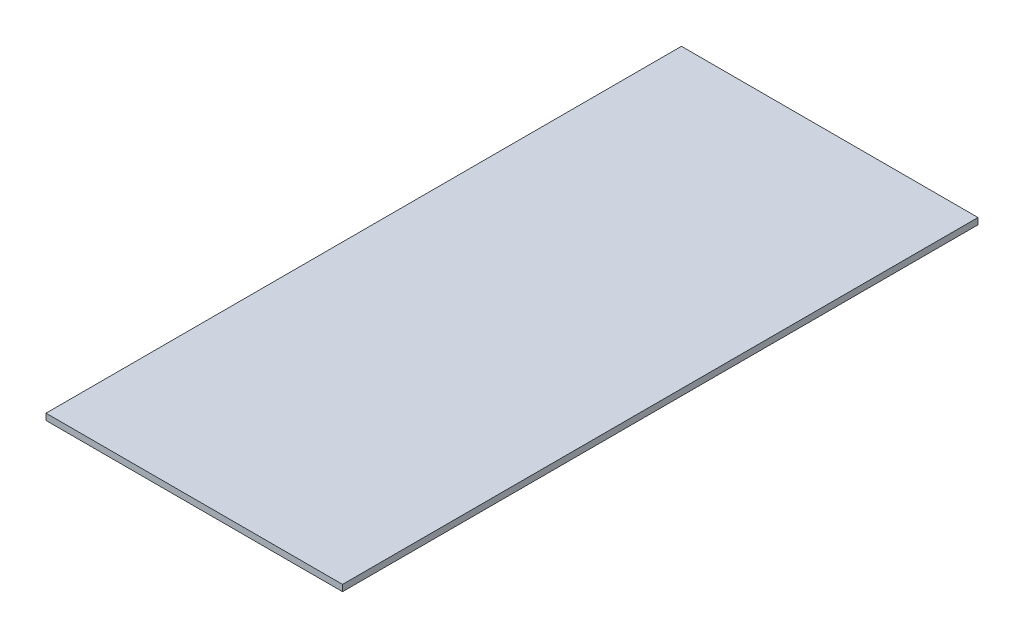
ISO-10303-21;
HEADER;
FILE_DESCRIPTION(('STEP AP214'),'2;1');
FILE_NAME('part.step','',(''),(''),'','','');
FILE_SCHEMA(('AUTOMOTIVE_DESIGN { 1 0 10303 214 1 1 1 1 }'));
ENDSEC;
DATA;
#1=APPLICATION_CONTEXT('core data for automotive mechanical design processes');
#2=APPLICATION_PROTOCOL_DEFINITION('international standard','automotive_design',2000,#1);
#3=PRODUCT_CONTEXT('',#1,'mechanical');
#4=PRODUCT('Part','Part','',(#3));
#5=PRODUCT_RELATED_PRODUCT_CATEGORY('part','',(#4));
#6=PRODUCT_DEFINITION_FORMATION('','',#4);
#7=PRODUCT_DEFINITION_CONTEXT('part definition',#1,'design');
#8=PRODUCT_DEFINITION('design','',#6,#7);
#9=PRODUCT_DEFINITION_SHAPE('','',#8);
#10=(LENGTH_UNIT() NAMED_UNIT(*) SI_UNIT(.MILLI.,.METRE.));
#11=(NAMED_UNIT(*) PLANE_ANGLE_UNIT() SI_UNIT($,.RADIAN.));
#12=(NAMED_UNIT(*) SI_UNIT($,.STERADIAN.) SOLID_ANGLE_UNIT());
#13=UNCERTAINTY_MEASURE_WITH_UNIT(LENGTH_MEASURE(1.E-05),#10,'distance_accuracy_value','');
#14=(GEOMETRIC_REPRESENTATION_CONTEXT(3) GLOBAL_UNCERTAINTY_ASSIGNED_CONTEXT((#13)) GLOBAL_UNIT_ASSIGNED_CONTEXT((#10,
#11,#12)) REPRESENTATION_CONTEXT('',''));
#15=CARTESIAN_POINT('',(0.,0.,0.));
#16=DIRECTION('',(0.,0.,1.));
#17=DIRECTION('',(1.,0.,0.));
#18=AXIS2_PLACEMENT_3D('',#15,#16,#17);
#19=CARTESIAN_POINT('',(0.,0.,0.));
#20=DIRECTION('',(0.,1.,0.));
#21=DIRECTION('',(1.,0.,0.));
#22=AXIS2_PLACEMENT_3D('',#19,#20,#21);
#23=PLANE('',#22);
#24=DIRECTION('',(0.,0.,-1.));
#25=VECTOR('',#24,1.);
#26=CARTESIAN_POINT('',(70.,0.,150.));
#27=LINE('',#26,#25);
#28=CARTESIAN_POINT('',(70.,0.,150.));
#29=VERTEX_POINT('',#28);
#30=CARTESIAN_POINT('',(70.,0.,-150.));
#31=VERTEX_POINT('',#30);
#32=EDGE_CURVE('E20',#29,#31,#27,.T.);
#33=ORIENTED_EDGE('',*,*,#32,.F.);
#34=DIRECTION('',(1.,0.,0.));
#35=VECTOR('',#34,1.);
#36=CARTESIAN_POINT('',(-70.,0.,150.));
#37=LINE('',#36,#35);
#38=CARTESIAN_POINT('',(-70.,0.,150.));
#39=VERTEX_POINT('',#38);
#40=EDGE_CURVE('E126',#39,#29,#37,.T.);
#41=ORIENTED_EDGE('',*,*,#40,.F.);
#42=DIRECTION('',(0.,0.,1.));
#43=VECTOR('',#42,1.);
#44=CARTESIAN_POINT('',(-70.,0.,-150.));
#45=LINE('',#44,#43);
#46=CARTESIAN_POINT('',(-70.,0.,-150.));
#47=VERTEX_POINT('',#46);
#48=EDGE_CURVE('E83',#47,#39,#45,.T.);
#49=ORIENTED_EDGE('',*,*,#48,.F.);
#50=DIRECTION('',(-1.,0.,0.));
#51=VECTOR('',#50,1.);
#52=CARTESIAN_POINT('',(70.,0.,-150.));
#53=LINE('',#52,#51);
#54=EDGE_CURVE('E68',#31,#47,#53,.T.);
#55=ORIENTED_EDGE('',*,*,#54,.F.);
#56=EDGE_LOOP('',(#33,#41,#49,#55));
#57=FACE_BOUND('',#56,.T.);
#58=ADVANCED_FACE('F17',(#57),#23,.F.);
#59=CARTESIAN_POINT('',(0.,3.,0.));
#60=DIRECTION('',(0.,1.,0.));
#61=DIRECTION('',(1.,0.,0.));
#62=AXIS2_PLACEMENT_3D('',#59,#60,#61);
#63=PLANE('',#62);
#64=DIRECTION('',(0.,0.,-1.));
#65=VECTOR('',#64,1.);
#66=CARTESIAN_POINT('',(70.,3.,150.));
#67=LINE('',#66,#65);
#68=CARTESIAN_POINT('',(70.,3.,150.));
#69=VERTEX_POINT('',#68);
#70=CARTESIAN_POINT('',(70.,3.,-150.));
#71=VERTEX_POINT('',#70);
#72=EDGE_CURVE('E11',#69,#71,#67,.T.);
#73=ORIENTED_EDGE('',*,*,#72,.T.);
#74=DIRECTION('',(-1.,0.,0.));
#75=VECTOR('',#74,1.);
#76=CARTESIAN_POINT('',(70.,3.,-150.));
#77=LINE('',#76,#75);
#78=CARTESIAN_POINT('',(-70.,3.,-150.));
#79=VERTEX_POINT('',#78);
#80=EDGE_CURVE('E59',#71,#79,#77,.T.);
#81=ORIENTED_EDGE('',*,*,#80,.T.);
#82=DIRECTION('',(0.,0.,1.));
#83=VECTOR('',#82,1.);
#84=CARTESIAN_POINT('',(-70.,3.,-150.));
#85=LINE('',#84,#83);
#86=CARTESIAN_POINT('',(-70.,3.,150.));
#87=VERTEX_POINT('',#86);
#88=EDGE_CURVE('E62',#79,#87,#85,.T.);
#89=ORIENTED_EDGE('',*,*,#88,.T.);
#90=DIRECTION('',(1.,0.,0.));
#91=VECTOR('',#90,1.);
#92=CARTESIAN_POINT('',(-70.,3.,150.));
#93=LINE('',#92,#91);
#94=EDGE_CURVE('E116',#87,#69,#93,.T.);
#95=ORIENTED_EDGE('',*,*,#94,.T.);
#96=EDGE_LOOP('',(#73,#81,#89,#95));
#97=FACE_BOUND('',#96,.T.);
#98=ADVANCED_FACE('F58',(#97),#63,.T.);
#99=CARTESIAN_POINT('',(70.,0.,150.));
#100=DIRECTION('',(1.,0.,0.));
#101=DIRECTION('',(0.,0.,-1.));
#102=AXIS2_PLACEMENT_3D('',#99,#100,#101);
#103=PLANE('',#102);
#104=ORIENTED_EDGE('',*,*,#32,.T.);
#105=DIRECTION('',(0.,1.,0.));
#106=VECTOR('',#105,1.);
#107=CARTESIAN_POINT('',(70.,0.,-150.));
#108=LINE('',#107,#106);
#109=EDGE_CURVE('E70',#31,#71,#108,.T.);
#110=ORIENTED_EDGE('',*,*,#109,.T.);
#111=ORIENTED_EDGE('',*,*,#72,.F.);
#112=DIRECTION('',(0.,1.,0.));
#113=VECTOR('',#112,1.);
#114=CARTESIAN_POINT('',(70.,0.,150.));
#115=LINE('',#114,#113);
#116=EDGE_CURVE('E120',#29,#69,#115,.T.);
#117=ORIENTED_EDGE('',*,*,#116,.F.);
#118=EDGE_LOOP('',(#104,#110,#111,#117));
#119=FACE_BOUND('',#118,.T.);
#120=ADVANCED_FACE('F163',(#119),#103,.T.);
#121=CARTESIAN_POINT('',(70.,0.,-150.));
#122=DIRECTION('',(0.,0.,-1.));
#123=DIRECTION('',(0.,-1.,0.));
#124=AXIS2_PLACEMENT_3D('',#121,#122,#123);
#125=PLANE('',#124);
#126=ORIENTED_EDGE('',*,*,#54,.T.);
#127=DIRECTION('',(0.,1.,0.));
#128=VECTOR('',#127,1.);
#129=CARTESIAN_POINT('',(-70.,0.,-150.));
#130=LINE('',#129,#128);
#131=EDGE_CURVE('E69',#47,#79,#130,.T.);
#132=ORIENTED_EDGE('',*,*,#131,.T.);
#133=ORIENTED_EDGE('',*,*,#80,.F.);
#134=ORIENTED_EDGE('',*,*,#109,.F.);
#135=EDGE_LOOP('',(#126,#132,#133,#134));
#136=FACE_BOUND('',#135,.T.);
#137=ADVANCED_FACE('F75',(#136),#125,.T.);
#138=CARTESIAN_POINT('',(-70.,0.,-150.));
#139=DIRECTION('',(-1.,0.,0.));
#140=DIRECTION('',(0.,0.,1.));
#141=AXIS2_PLACEMENT_3D('',#138,#139,#140);
#142=PLANE('',#141);
#143=ORIENTED_EDGE('',*,*,#48,.T.);
#144=DIRECTION('',(0.,1.,0.));
#145=VECTOR('',#144,1.);
#146=CARTESIAN_POINT('',(-70.,0.,150.));
#147=LINE('',#146,#145);
#148=EDGE_CURVE('E79',#39,#87,#147,.T.);
#149=ORIENTED_EDGE('',*,*,#148,.T.);
#150=ORIENTED_EDGE('',*,*,#88,.F.);
#151=ORIENTED_EDGE('',*,*,#131,.F.);
#152=EDGE_LOOP('',(#143,#149,#150,#151));
#153=FACE_BOUND('',#152,.T.);
#154=ADVANCED_FACE('F77',(#153),#142,.T.);
#155=CARTESIAN_POINT('',(-70.,0.,150.));
#156=DIRECTION('',(0.,0.,1.));
#157=DIRECTION('',(1.,0.,0.));
#158=AXIS2_PLACEMENT_3D('',#155,#156,#157);
#159=PLANE('',#158);
#160=ORIENTED_EDGE('',*,*,#40,.T.);
#161=ORIENTED_EDGE('',*,*,#116,.T.);
#162=ORIENTED_EDGE('',*,*,#94,.F.);
#163=ORIENTED_EDGE('',*,*,#148,.F.);
#164=EDGE_LOOP('',(#160,#161,#162,#163));
#165=FACE_BOUND('',#164,.T.);
#166=ADVANCED_FACE('F143',(#165),#159,.T.);
#167=CLOSED_SHELL('',(#58,#98,#120,#137,#154,#166));
#168=MANIFOLD_SOLID_BREP('B1',#167);
#169=ADVANCED_BREP_SHAPE_REPRESENTATION('',(#18,#168),#14);
#170=SHAPE_DEFINITION_REPRESENTATION(#9,#169);
ENDSEC;
END-ISO-10303-21;
